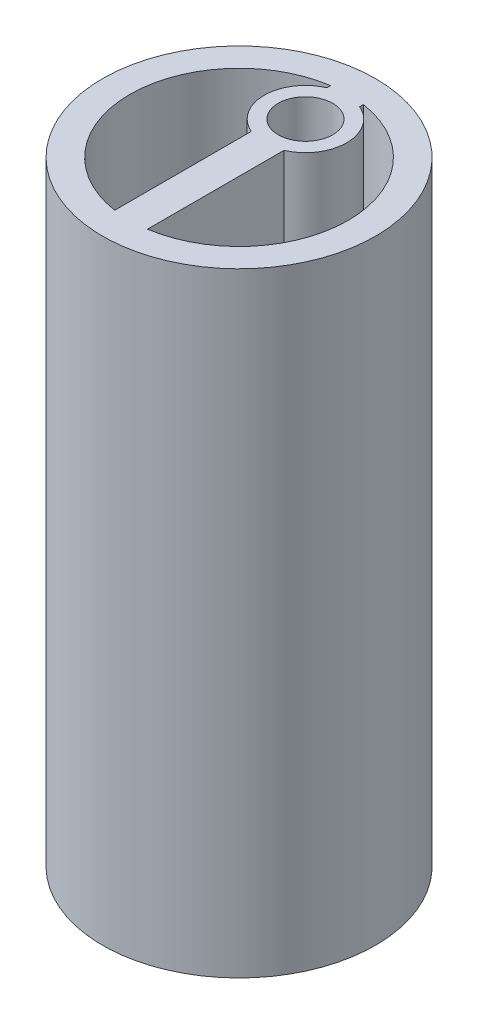
ISO-10303-21;
HEADER;
FILE_DESCRIPTION(('STEP AP214'),'2;1');
FILE_NAME('part.step','',(''),(''),'','','');
FILE_SCHEMA(('AUTOMOTIVE_DESIGN { 1 0 10303 214 1 1 1 1 }'));
ENDSEC;
DATA;
#1=APPLICATION_CONTEXT('core data for automotive mechanical design processes');
#2=APPLICATION_PROTOCOL_DEFINITION('international standard','automotive_design',2000,#1);
#3=PRODUCT_CONTEXT('',#1,'mechanical');
#4=PRODUCT('Part','Part','',(#3));
#5=PRODUCT_RELATED_PRODUCT_CATEGORY('part','',(#4));
#6=PRODUCT_DEFINITION_FORMATION('','',#4);
#7=PRODUCT_DEFINITION_CONTEXT('part definition',#1,'design');
#8=PRODUCT_DEFINITION('design','',#6,#7);
#9=PRODUCT_DEFINITION_SHAPE('','',#8);
#10=(LENGTH_UNIT() NAMED_UNIT(*) SI_UNIT(.MILLI.,.METRE.));
#11=(NAMED_UNIT(*) PLANE_ANGLE_UNIT() SI_UNIT($,.RADIAN.));
#12=(NAMED_UNIT(*) SI_UNIT($,.STERADIAN.) SOLID_ANGLE_UNIT());
#13=UNCERTAINTY_MEASURE_WITH_UNIT(LENGTH_MEASURE(1.E-05),#10,'distance_accuracy_value','');
#14=(GEOMETRIC_REPRESENTATION_CONTEXT(3) GLOBAL_UNCERTAINTY_ASSIGNED_CONTEXT((#13)) GLOBAL_UNIT_ASSIGNED_CONTEXT((#10,
#11,#12)) REPRESENTATION_CONTEXT('',''));
#15=CARTESIAN_POINT('',(0.,0.,0.));
#16=DIRECTION('',(0.,0.,1.));
#17=DIRECTION('',(1.,0.,0.));
#18=AXIS2_PLACEMENT_3D('',#15,#16,#17);
#19=CARTESIAN_POINT('',(-1.2,0.,-8.99315534845702));
#20=DIRECTION('',(-1.,0.,0.));
#21=DIRECTION('',(0.,0.,1.));
#22=AXIS2_PLACEMENT_3D('',#19,#20,#21);
#23=PLANE('',#22);
#24=DIRECTION('',(0.,1.,0.));
#25=VECTOR('',#24,1.);
#26=CARTESIAN_POINT('',(-1.2,0.,-2.09321424438531));
#27=LINE('',#26,#25);
#28=CARTESIAN_POINT('',(-1.2,0.,-2.09321424438531));
#29=VERTEX_POINT('',#28);
#30=CARTESIAN_POINT('',(-1.2,45.,-2.09321424438531));
#31=VERTEX_POINT('',#30);
#32=EDGE_CURVE('E185',#29,#31,#27,.T.);
#33=ORIENTED_EDGE('',*,*,#32,.F.);
#34=DIRECTION('',(0.,0.,1.));
#35=VECTOR('',#34,1.);
#36=CARTESIAN_POINT('',(-1.2,0.,-8.99315534845702));
#37=LINE('',#36,#35);
#38=CARTESIAN_POINT('',(-1.2,0.,7.90948797331408));
#39=VERTEX_POINT('',#38);
#40=EDGE_CURVE('E126',#29,#39,#37,.T.);
#41=ORIENTED_EDGE('',*,*,#40,.T.);
#42=DIRECTION('',(0.,-1.,0.));
#43=VECTOR('',#42,1.);
#44=CARTESIAN_POINT('',(-1.2,45.,7.90948797331407));
#45=LINE('',#44,#43);
#46=CARTESIAN_POINT('',(-1.2,45.,7.90948797331408));
#47=VERTEX_POINT('',#46);
#48=EDGE_CURVE('E160',#39,#47,#45,.F.);
#49=ORIENTED_EDGE('',*,*,#48,.T.);
#50=DIRECTION('',(0.,0.,1.));
#51=VECTOR('',#50,1.);
#52=CARTESIAN_POINT('',(-1.2,45.,-8.99315534845702));
#53=LINE('',#52,#51);
#54=EDGE_CURVE('E195',#31,#47,#53,.T.);
#55=ORIENTED_EDGE('',*,*,#54,.F.);
#56=EDGE_LOOP('',(#33,#41,#49,#55));
#57=FACE_BOUND('',#56,.T.);
#58=ADVANCED_FACE('F39',(#57),#23,.T.);
#59=CARTESIAN_POINT('',(1.2,0.,-8.99315534845702));
#60=DIRECTION('',(1.,0.,0.));
#61=DIRECTION('',(0.,0.,-1.));
#62=AXIS2_PLACEMENT_3D('',#59,#60,#61);
#63=PLANE('',#62);
#64=DIRECTION('',(0.,1.,0.));
#65=VECTOR('',#64,1.);
#66=CARTESIAN_POINT('',(1.2,0.,-7.63509099624298));
#67=LINE('',#66,#65);
#68=CARTESIAN_POINT('',(1.2,0.,-7.63509099624298));
#69=VERTEX_POINT('',#68);
#70=CARTESIAN_POINT('',(1.2,45.,-7.63509099624298));
#71=VERTEX_POINT('',#70);
#72=EDGE_CURVE('E11',#69,#71,#67,.T.);
#73=ORIENTED_EDGE('',*,*,#72,.F.);
#74=DIRECTION('',(0.,0.,-1.));
#75=VECTOR('',#74,1.);
#76=CARTESIAN_POINT('',(1.2,0.,-8.99315534845702));
#77=LINE('',#76,#75);
#78=CARTESIAN_POINT('',(1.2,0.,-7.90948797331408));
#79=VERTEX_POINT('',#78);
#80=EDGE_CURVE('E182',#69,#79,#77,.T.);
#81=ORIENTED_EDGE('',*,*,#80,.T.);
#82=DIRECTION('',(0.,-1.,0.));
#83=VECTOR('',#82,1.);
#84=CARTESIAN_POINT('',(1.2,45.,-7.90948797331407));
#85=LINE('',#84,#83);
#86=CARTESIAN_POINT('',(1.2,45.,-7.90948797331408));
#87=VERTEX_POINT('',#86);
#88=EDGE_CURVE('E150',#79,#87,#85,.F.);
#89=ORIENTED_EDGE('',*,*,#88,.T.);
#90=DIRECTION('',(0.,0.,-1.));
#91=VECTOR('',#90,1.);
#92=CARTESIAN_POINT('',(1.2,45.,-8.99315534845702));
#93=LINE('',#92,#91);
#94=EDGE_CURVE('E127',#71,#87,#93,.T.);
#95=ORIENTED_EDGE('',*,*,#94,.F.);
#96=EDGE_LOOP('',(#73,#81,#89,#95));
#97=FACE_BOUND('',#96,.T.);
#98=ADVANCED_FACE('F228',(#97),#63,.T.);
#99=CARTESIAN_POINT('',(0.,45.,0.));
#100=DIRECTION('',(0.,-1.,0.));
#101=DIRECTION('',(0.,0.,-1.));
#102=AXIS2_PLACEMENT_3D('',#99,#100,#101);
#103=CYLINDRICAL_SURFACE('',#102,8.);
#104=DIRECTION('',(0.,-1.,0.));
#105=VECTOR('',#104,1.);
#106=CARTESIAN_POINT('',(-1.2,45.,-7.90948797331407));
#107=LINE('',#106,#105);
#108=CARTESIAN_POINT('',(-1.2,45.,-7.90948797331408));
#109=VERTEX_POINT('',#108);
#110=CARTESIAN_POINT('',(-1.2,0.,-7.90948797331408));
#111=VERTEX_POINT('',#110);
#112=EDGE_CURVE('E119',#109,#111,#107,.T.);
#113=ORIENTED_EDGE('',*,*,#112,.F.);
#114=CARTESIAN_POINT('',(0.,45.,0.));
#115=DIRECTION('',(0.,1.,0.));
#116=DIRECTION('',(0.,0.,1.));
#117=AXIS2_PLACEMENT_3D('',#114,#115,#116);
#118=CIRCLE('',#117,8.);
#119=EDGE_CURVE('E140',#109,#47,#118,.T.);
#120=ORIENTED_EDGE('',*,*,#119,.T.);
#121=ORIENTED_EDGE('',*,*,#48,.F.);
#122=CARTESIAN_POINT('',(0.,0.,0.));
#123=DIRECTION('',(0.,1.,0.));
#124=DIRECTION('',(0.,0.,1.));
#125=AXIS2_PLACEMENT_3D('',#122,#123,#124);
#126=CIRCLE('',#125,8.);
#127=EDGE_CURVE('E145',#111,#39,#126,.T.);
#128=ORIENTED_EDGE('',*,*,#127,.F.);
#129=EDGE_LOOP('',(#113,#120,#121,#128));
#130=FACE_BOUND('',#129,.T.);
#131=ADVANCED_FACE('F191',(#130),#103,.F.);
#132=CARTESIAN_POINT('',(0.,45.,0.));
#133=DIRECTION('',(0.,1.,0.));
#134=DIRECTION('',(0.,0.,1.));
#135=AXIS2_PLACEMENT_3D('',#132,#133,#134);
#136=PLANE('',#135);
#137=CARTESIAN_POINT('',(0.,45.,-4.86415262031414));
#138=DIRECTION('',(0.,1.,0.));
#139=DIRECTION('',(0.,0.,1.));
#140=AXIS2_PLACEMENT_3D('',#137,#138,#139);
#141=CIRCLE('',#140,2.);
#142=CARTESIAN_POINT('',(0.,45.,-2.86415262031414));
#143=VERTEX_POINT('',#142);
#144=EDGE_CURVE('E205',#143,#143,#141,.T.);
#145=ORIENTED_EDGE('',*,*,#144,.F.);
#146=EDGE_LOOP('',(#145));
#147=FACE_BOUND('',#146,.T.);
#148=CARTESIAN_POINT('',(-1.2,45.,-7.63509099624298));
#149=VERTEX_POINT('',#148);
#150=EDGE_CURVE('E133',#109,#149,#53,.T.);
#151=ORIENTED_EDGE('',*,*,#150,.T.);
#152=CARTESIAN_POINT('',(0.,45.,-4.86415262031414));
#153=DIRECTION('',(0.,1.,0.));
#154=DIRECTION('',(0.,0.,1.));
#155=AXIS2_PLACEMENT_3D('',#152,#153,#154);
#156=CIRCLE('',#155,3.01961909571309);
#157=EDGE_CURVE('E55',#149,#31,#156,.T.);
#158=ORIENTED_EDGE('',*,*,#157,.T.);
#159=ORIENTED_EDGE('',*,*,#54,.T.);
#160=ORIENTED_EDGE('',*,*,#119,.F.);
#161=EDGE_LOOP('',(#151,#158,#159,#160));
#162=FACE_BOUND('',#161,.T.);
#163=CARTESIAN_POINT('',(1.2,45.,-2.09321424438531));
#164=VERTEX_POINT('',#163);
#165=EDGE_CURVE('E63',#164,#71,#156,.T.);
#166=ORIENTED_EDGE('',*,*,#165,.T.);
#167=ORIENTED_EDGE('',*,*,#94,.T.);
#168=CARTESIAN_POINT('',(1.2,45.,7.90948797331408));
#169=VERTEX_POINT('',#168);
#170=EDGE_CURVE('E123',#169,#87,#118,.T.);
#171=ORIENTED_EDGE('',*,*,#170,.F.);
#172=EDGE_CURVE('E115',#169,#164,#93,.T.);
#173=ORIENTED_EDGE('',*,*,#172,.T.);
#174=EDGE_LOOP('',(#166,#167,#171,#173));
#175=FACE_BOUND('',#174,.T.);
#176=CARTESIAN_POINT('',(0.,45.,0.));
#177=DIRECTION('',(0.,1.,0.));
#178=DIRECTION('',(0.,0.,1.));
#179=AXIS2_PLACEMENT_3D('',#176,#177,#178);
#180=CIRCLE('',#179,10.);
#181=CARTESIAN_POINT('',(0.,45.,-10.));
#182=VERTEX_POINT('',#181);
#183=EDGE_CURVE('E146',#182,#182,#180,.T.);
#184=ORIENTED_EDGE('',*,*,#183,.T.);
#185=EDGE_LOOP('',(#184));
#186=FACE_BOUND('',#185,.T.);
#187=ADVANCED_FACE('F120',(#147,#162,#175,#186),#136,.T.);
#188=CARTESIAN_POINT('',(0.,0.,0.));
#189=DIRECTION('',(0.,1.,0.));
#190=DIRECTION('',(0.,0.,1.));
#191=AXIS2_PLACEMENT_3D('',#188,#189,#190);
#192=PLANE('',#191);
#193=CARTESIAN_POINT('',(0.,0.,-4.86415262031414));
#194=DIRECTION('',(0.,1.,0.));
#195=DIRECTION('',(0.,0.,1.));
#196=AXIS2_PLACEMENT_3D('',#193,#194,#195);
#197=CIRCLE('',#196,2.);
#198=CARTESIAN_POINT('',(0.,0.,-2.86415262031414));
#199=VERTEX_POINT('',#198);
#200=EDGE_CURVE('E209',#199,#199,#197,.T.);
#201=ORIENTED_EDGE('',*,*,#200,.T.);
#202=EDGE_LOOP('',(#201));
#203=FACE_BOUND('',#202,.T.);
#204=CARTESIAN_POINT('',(0.,0.,-4.86415262031414));
#205=DIRECTION('',(0.,1.,0.));
#206=DIRECTION('',(0.,0.,1.));
#207=AXIS2_PLACEMENT_3D('',#204,#205,#206);
#208=CIRCLE('',#207,3.01961909571309);
#209=CARTESIAN_POINT('',(-1.2,0.,-7.63509099624298));
#210=VERTEX_POINT('',#209);
#211=EDGE_CURVE('E108',#210,#29,#208,.T.);
#212=ORIENTED_EDGE('',*,*,#211,.F.);
#213=EDGE_CURVE('E131',#111,#210,#37,.T.);
#214=ORIENTED_EDGE('',*,*,#213,.F.);
#215=ORIENTED_EDGE('',*,*,#127,.T.);
#216=ORIENTED_EDGE('',*,*,#40,.F.);
#217=EDGE_LOOP('',(#212,#214,#215,#216));
#218=FACE_BOUND('',#217,.T.);
#219=ORIENTED_EDGE('',*,*,#80,.F.);
#220=CARTESIAN_POINT('',(1.2,0.,-2.09321424438531));
#221=VERTEX_POINT('',#220);
#222=EDGE_CURVE('E201',#221,#69,#208,.T.);
#223=ORIENTED_EDGE('',*,*,#222,.F.);
#224=CARTESIAN_POINT('',(1.2,0.,7.90948797331408));
#225=VERTEX_POINT('',#224);
#226=EDGE_CURVE('E117',#225,#221,#77,.T.);
#227=ORIENTED_EDGE('',*,*,#226,.F.);
#228=EDGE_CURVE('E141',#225,#79,#126,.T.);
#229=ORIENTED_EDGE('',*,*,#228,.T.);
#230=EDGE_LOOP('',(#219,#223,#227,#229));
#231=FACE_BOUND('',#230,.T.);
#232=CARTESIAN_POINT('',(0.,0.,0.));
#233=DIRECTION('',(0.,1.,0.));
#234=DIRECTION('',(0.,0.,1.));
#235=AXIS2_PLACEMENT_3D('',#232,#233,#234);
#236=CIRCLE('',#235,10.);
#237=CARTESIAN_POINT('',(0.,0.,-10.));
#238=VERTEX_POINT('',#237);
#239=EDGE_CURVE('E139',#238,#238,#236,.T.);
#240=ORIENTED_EDGE('',*,*,#239,.F.);
#241=EDGE_LOOP('',(#240));
#242=FACE_BOUND('',#241,.T.);
#243=ADVANCED_FACE('F178',(#203,#218,#231,#242),#192,.F.);
#244=CARTESIAN_POINT('',(0.,45.,0.));
#245=DIRECTION('',(0.,-1.,0.));
#246=DIRECTION('',(0.,0.,-1.));
#247=AXIS2_PLACEMENT_3D('',#244,#245,#246);
#248=CYLINDRICAL_SURFACE('',#247,10.);
#249=CARTESIAN_POINT('',(0.,45.,-10.));
#250=CARTESIAN_POINT('',(0.,44.53125,-10.));
#251=CARTESIAN_POINT('',(0.,44.0625,-10.));
#252=CARTESIAN_POINT('',(0.,43.125,-10.));
#253=CARTESIAN_POINT('',(0.,42.65625,-10.));
#254=CARTESIAN_POINT('',(0.,41.71875,-10.));
#255=CARTESIAN_POINT('',(0.,41.25,-10.));
#256=CARTESIAN_POINT('',(0.,40.3125,-10.));
#257=CARTESIAN_POINT('',(0.,39.84375,-10.));
#258=CARTESIAN_POINT('',(0.,38.90625,-10.));
#259=CARTESIAN_POINT('',(0.,38.4375,-10.));
#260=CARTESIAN_POINT('',(0.,37.5,-10.));
#261=CARTESIAN_POINT('',(0.,37.03125,-10.));
#262=CARTESIAN_POINT('',(0.,36.09375,-10.));
#263=CARTESIAN_POINT('',(0.,35.625,-10.));
#264=CARTESIAN_POINT('',(0.,34.6875,-10.));
#265=CARTESIAN_POINT('',(0.,34.21875,-10.));
#266=CARTESIAN_POINT('',(0.,33.28125,-10.));
#267=CARTESIAN_POINT('',(0.,32.8125,-10.));
#268=CARTESIAN_POINT('',(0.,31.875,-10.));
#269=CARTESIAN_POINT('',(0.,31.40625,-10.));
#270=CARTESIAN_POINT('',(0.,30.46875,-10.));
#271=CARTESIAN_POINT('',(0.,30.,-10.));
#272=CARTESIAN_POINT('',(0.,29.0625,-10.));
#273=CARTESIAN_POINT('',(0.,28.59375,-10.));
#274=CARTESIAN_POINT('',(0.,27.65625,-10.));
#275=CARTESIAN_POINT('',(0.,27.1875,-10.));
#276=CARTESIAN_POINT('',(0.,26.25,-10.));
#277=CARTESIAN_POINT('',(0.,25.78125,-10.));
#278=CARTESIAN_POINT('',(0.,24.84375,-10.));
#279=CARTESIAN_POINT('',(0.,24.375,-10.));
#280=CARTESIAN_POINT('',(0.,23.4375,-10.));
#281=CARTESIAN_POINT('',(0.,22.96875,-10.));
#282=CARTESIAN_POINT('',(0.,22.03125,-10.));
#283=CARTESIAN_POINT('',(0.,21.5625,-10.));
#284=CARTESIAN_POINT('',(0.,20.625,-10.));
#285=CARTESIAN_POINT('',(0.,20.15625,-10.));
#286=CARTESIAN_POINT('',(0.,19.21875,-10.));
#287=CARTESIAN_POINT('',(0.,18.75,-10.));
#288=CARTESIAN_POINT('',(0.,17.8125,-10.));
#289=CARTESIAN_POINT('',(0.,17.34375,-10.));
#290=CARTESIAN_POINT('',(0.,16.40625,-10.));
#291=CARTESIAN_POINT('',(0.,15.9375,-10.));
#292=CARTESIAN_POINT('',(0.,15.,-10.));
#293=CARTESIAN_POINT('',(0.,14.53125,-10.));
#294=CARTESIAN_POINT('',(0.,13.59375,-10.));
#295=CARTESIAN_POINT('',(0.,13.125,-10.));
#296=CARTESIAN_POINT('',(0.,12.1875,-10.));
#297=CARTESIAN_POINT('',(0.,11.71875,-10.));
#298=CARTESIAN_POINT('',(0.,10.78125,-10.));
#299=CARTESIAN_POINT('',(0.,10.3125,-10.));
#300=CARTESIAN_POINT('',(0.,9.375,-10.));
#301=CARTESIAN_POINT('',(0.,8.90625,-10.));
#302=CARTESIAN_POINT('',(0.,7.96874999999999,-10.));
#303=CARTESIAN_POINT('',(0.,7.5,-10.));
#304=CARTESIAN_POINT('',(0.,6.5625,-10.));
#305=CARTESIAN_POINT('',(0.,6.09375,-10.));
#306=CARTESIAN_POINT('',(0.,5.15625,-10.));
#307=CARTESIAN_POINT('',(0.,4.68749999999999,-10.));
#308=CARTESIAN_POINT('',(0.,3.74999999999999,-10.));
#309=CARTESIAN_POINT('',(0.,3.28124999999999,-10.));
#310=CARTESIAN_POINT('',(0.,2.34374999999999,-10.));
#311=CARTESIAN_POINT('',(0.,1.87499999999999,-10.));
#312=CARTESIAN_POINT('',(0.,0.937499999999992,-10.));
#313=CARTESIAN_POINT('',(0.,0.468749999999993,-10.));
#314=CARTESIAN_POINT('',(0.,0.,-10.));
#315=B_SPLINE_CURVE_WITH_KNOTS('',3,(#249,#250,#251,#252,#253,#254,#255,#256,#257,#258,#259,
#260,#261,#262,#263,#264,#265,#266,#267,#268,#269,#270,#271,#272,#273,#274,#275,#276,#277,#278,
#279,#280,#281,#282,#283,#284,#285,#286,#287,#288,#289,#290,#291,#292,#293,#294,#295,#296,#297,
#298,#299,#300,#301,#302,#303,#304,#305,#306,#307,#308,#309,#310,#311,#312,#313,#314),
.UNSPECIFIED.,.F.,.F.,(4,2,2,2,2,2,2,2,2,2,2,2,2,2,2,2,2,2,2,2,2,2,2,2,2,2,2,2,2,2,2,2,4),(0.,
1.40625,2.8125,4.21875000000001,5.62500000000001,7.03125,8.4375,9.84375000000001,11.25,12.65625,
14.0625,15.46875,16.875,18.28125,19.6875,21.09375,22.5,23.90625,25.3125,26.71875,28.125,
29.53125,30.9375,32.34375,33.75,35.15625,36.5625,37.96875,39.375,40.78125,42.1875,43.59375,45.),.UNSPECIFIED.);
#316=EDGE_CURVE('BSEAM41',#182,#238,#315,.T.);
#317=ORIENTED_EDGE('',*,*,#183,.F.);
#318=ORIENTED_EDGE('',*,*,#239,.T.);
#319=ORIENTED_EDGE('',*,*,#316,.T.);
#320=ORIENTED_EDGE('',*,*,#316,.F.);
#321=EDGE_LOOP('',(#317,#319,#318,#320));
#322=FACE_BOUND('',#321,.T.);
#323=ADVANCED_FACE('F41',(#322),#248,.T.);
#324=DIRECTION('',(0.,-1.,0.));
#325=VECTOR('',#324,1.);
#326=CARTESIAN_POINT('',(1.2,45.,7.90948797331407));
#327=LINE('',#326,#325);
#328=EDGE_CURVE('E157',#169,#225,#327,.T.);
#329=ORIENTED_EDGE('',*,*,#328,.F.);
#330=ORIENTED_EDGE('',*,*,#170,.T.);
#331=ORIENTED_EDGE('',*,*,#88,.F.);
#332=ORIENTED_EDGE('',*,*,#228,.F.);
#333=EDGE_LOOP('',(#329,#330,#331,#332));
#334=FACE_BOUND('',#333,.T.);
#335=ADVANCED_FACE('F236',(#334),#103,.F.);
#336=DIRECTION('',(0.,1.,0.));
#337=VECTOR('',#336,1.);
#338=CARTESIAN_POINT('',(-1.2,0.,-7.63509099624298));
#339=LINE('',#338,#337);
#340=EDGE_CURVE('E198',#149,#210,#339,.F.);
#341=ORIENTED_EDGE('',*,*,#340,.F.);
#342=ORIENTED_EDGE('',*,*,#150,.F.);
#343=ORIENTED_EDGE('',*,*,#112,.T.);
#344=ORIENTED_EDGE('',*,*,#213,.T.);
#345=EDGE_LOOP('',(#341,#342,#343,#344));
#346=FACE_BOUND('',#345,.T.);
#347=ADVANCED_FACE('F172',(#346),#23,.T.);
#348=DIRECTION('',(0.,1.,0.));
#349=VECTOR('',#348,1.);
#350=CARTESIAN_POINT('',(1.2,0.,-2.09321424438531));
#351=LINE('',#350,#349);
#352=EDGE_CURVE('E48',#164,#221,#351,.F.);
#353=ORIENTED_EDGE('',*,*,#352,.F.);
#354=ORIENTED_EDGE('',*,*,#172,.F.);
#355=ORIENTED_EDGE('',*,*,#328,.T.);
#356=ORIENTED_EDGE('',*,*,#226,.T.);
#357=EDGE_LOOP('',(#353,#354,#355,#356));
#358=FACE_BOUND('',#357,.T.);
#359=ADVANCED_FACE('F113',(#358),#63,.T.);
#360=CARTESIAN_POINT('',(0.,0.,-4.86415262031414));
#361=DIRECTION('',(0.,1.,0.));
#362=DIRECTION('',(0.,0.,1.));
#363=AXIS2_PLACEMENT_3D('',#360,#361,#362);
#364=CYLINDRICAL_SURFACE('',#363,3.01961909571309);
#365=ORIENTED_EDGE('',*,*,#222,.T.);
#366=ORIENTED_EDGE('',*,*,#72,.T.);
#367=ORIENTED_EDGE('',*,*,#165,.F.);
#368=ORIENTED_EDGE('',*,*,#352,.T.);
#369=EDGE_LOOP('',(#365,#366,#367,#368));
#370=FACE_BOUND('',#369,.T.);
#371=ADVANCED_FACE('F103',(#370),#364,.T.);
#372=ORIENTED_EDGE('',*,*,#211,.T.);
#373=ORIENTED_EDGE('',*,*,#32,.T.);
#374=ORIENTED_EDGE('',*,*,#157,.F.);
#375=ORIENTED_EDGE('',*,*,#340,.T.);
#376=EDGE_LOOP('',(#372,#373,#374,#375));
#377=FACE_BOUND('',#376,.T.);
#378=ADVANCED_FACE('F216',(#377),#364,.T.);
#379=CARTESIAN_POINT('',(0.,0.,-4.86415262031414));
#380=DIRECTION('',(0.,1.,0.));
#381=DIRECTION('',(0.,0.,1.));
#382=AXIS2_PLACEMENT_3D('',#379,#380,#381);
#383=CYLINDRICAL_SURFACE('',#382,2.);
#384=CARTESIAN_POINT('',(0.,0.,-2.86415262031414));
#385=CARTESIAN_POINT('',(0.,0.468749999999999,-2.86415262031414));
#386=CARTESIAN_POINT('',(0.,0.9375,-2.86415262031414));
#387=CARTESIAN_POINT('',(0.,1.875,-2.86415262031414));
#388=CARTESIAN_POINT('',(0.,2.34375,-2.86415262031414));
#389=CARTESIAN_POINT('',(0.,3.28125,-2.86415262031414));
#390=CARTESIAN_POINT('',(0.,3.75,-2.86415262031414));
#391=CARTESIAN_POINT('',(0.,4.6875,-2.86415262031414));
#392=CARTESIAN_POINT('',(0.,5.15625,-2.86415262031414));
#393=CARTESIAN_POINT('',(0.,6.09375,-2.86415262031414));
#394=CARTESIAN_POINT('',(0.,6.5625,-2.86415262031414));
#395=CARTESIAN_POINT('',(0.,7.5,-2.86415262031414));
#396=CARTESIAN_POINT('',(0.,7.96875,-2.86415262031414));
#397=CARTESIAN_POINT('',(0.,8.90625,-2.86415262031414));
#398=CARTESIAN_POINT('',(0.,9.375,-2.86415262031414));
#399=CARTESIAN_POINT('',(0.,10.3125,-2.86415262031414));
#400=CARTESIAN_POINT('',(0.,10.78125,-2.86415262031414));
#401=CARTESIAN_POINT('',(0.,11.71875,-2.86415262031414));
#402=CARTESIAN_POINT('',(0.,12.1875,-2.86415262031414));
#403=CARTESIAN_POINT('',(0.,13.125,-2.86415262031414));
#404=CARTESIAN_POINT('',(0.,13.59375,-2.86415262031414));
#405=CARTESIAN_POINT('',(0.,14.53125,-2.86415262031414));
#406=CARTESIAN_POINT('',(0.,15.,-2.86415262031414));
#407=CARTESIAN_POINT('',(0.,15.9375,-2.86415262031414));
#408=CARTESIAN_POINT('',(0.,16.40625,-2.86415262031414));
#409=CARTESIAN_POINT('',(0.,17.34375,-2.86415262031414));
#410=CARTESIAN_POINT('',(0.,17.8125,-2.86415262031414));
#411=CARTESIAN_POINT('',(0.,18.75,-2.86415262031414));
#412=CARTESIAN_POINT('',(0.,19.21875,-2.86415262031414));
#413=CARTESIAN_POINT('',(0.,20.15625,-2.86415262031414));
#414=CARTESIAN_POINT('',(0.,20.625,-2.86415262031414));
#415=CARTESIAN_POINT('',(0.,21.5625,-2.86415262031414));
#416=CARTESIAN_POINT('',(0.,22.03125,-2.86415262031414));
#417=CARTESIAN_POINT('',(0.,22.96875,-2.86415262031414));
#418=CARTESIAN_POINT('',(0.,23.4375,-2.86415262031414));
#419=CARTESIAN_POINT('',(0.,24.375,-2.86415262031414));
#420=CARTESIAN_POINT('',(0.,24.84375,-2.86415262031414));
#421=CARTESIAN_POINT('',(0.,25.78125,-2.86415262031414));
#422=CARTESIAN_POINT('',(0.,26.25,-2.86415262031414));
#423=CARTESIAN_POINT('',(0.,27.1875,-2.86415262031414));
#424=CARTESIAN_POINT('',(0.,27.65625,-2.86415262031414));
#425=CARTESIAN_POINT('',(0.,28.59375,-2.86415262031414));
#426=CARTESIAN_POINT('',(0.,29.0625,-2.86415262031414));
#427=CARTESIAN_POINT('',(0.,30.,-2.86415262031414));
#428=CARTESIAN_POINT('',(0.,30.46875,-2.86415262031414));
#429=CARTESIAN_POINT('',(0.,31.40625,-2.86415262031414));
#430=CARTESIAN_POINT('',(0.,31.875,-2.86415262031414));
#431=CARTESIAN_POINT('',(0.,32.8125,-2.86415262031414));
#432=CARTESIAN_POINT('',(0.,33.28125,-2.86415262031414));
#433=CARTESIAN_POINT('',(0.,34.21875,-2.86415262031414));
#434=CARTESIAN_POINT('',(0.,34.6875,-2.86415262031414));
#435=CARTESIAN_POINT('',(0.,35.625,-2.86415262031414));
#436=CARTESIAN_POINT('',(0.,36.09375,-2.86415262031414));
#437=CARTESIAN_POINT('',(0.,37.03125,-2.86415262031414));
#438=CARTESIAN_POINT('',(0.,37.5,-2.86415262031414));
#439=CARTESIAN_POINT('',(0.,38.4375,-2.86415262031414));
#440=CARTESIAN_POINT('',(0.,38.90625,-2.86415262031414));
#441=CARTESIAN_POINT('',(0.,39.84375,-2.86415262031414));
#442=CARTESIAN_POINT('',(0.,40.3125,-2.86415262031414));
#443=CARTESIAN_POINT('',(0.,41.25,-2.86415262031414));
#444=CARTESIAN_POINT('',(0.,41.71875,-2.86415262031414));
#445=CARTESIAN_POINT('',(0.,42.65625,-2.86415262031414));
#446=CARTESIAN_POINT('',(0.,43.125,-2.86415262031414));
#447=CARTESIAN_POINT('',(0.,44.0625,-2.86415262031414));
#448=CARTESIAN_POINT('',(0.,44.53125,-2.86415262031414));
#449=CARTESIAN_POINT('',(0.,45.,-2.86415262031414));
#450=B_SPLINE_CURVE_WITH_KNOTS('',3,(#384,#385,#386,#387,#388,#389,#390,#391,#392,#393,#394,
#395,#396,#397,#398,#399,#400,#401,#402,#403,#404,#405,#406,#407,#408,#409,#410,#411,#412,#413,
#414,#415,#416,#417,#418,#419,#420,#421,#422,#423,#424,#425,#426,#427,#428,#429,#430,#431,#432,
#433,#434,#435,#436,#437,#438,#439,#440,#441,#442,#443,#444,#445,#446,#447,#448,#449),
.UNSPECIFIED.,.F.,.F.,(4,2,2,2,2,2,2,2,2,2,2,2,2,2,2,2,2,2,2,2,2,2,2,2,2,2,2,2,2,2,2,2,4),(0.,
1.40625,2.8125,4.21875,5.625,7.03125,8.4375,9.84375,11.25,12.65625,14.0625,15.46875,16.875,
18.28125,19.6875,21.09375,22.5,23.90625,25.3125,26.71875,28.125,29.53125,30.9375,32.34375,33.75,
35.15625,36.5625,37.96875,39.375,40.78125,42.1875,43.59375,45.),.UNSPECIFIED.);
#451=EDGE_CURVE('BSEAM218',#199,#143,#450,.T.);
#452=ORIENTED_EDGE('',*,*,#200,.F.);
#453=ORIENTED_EDGE('',*,*,#144,.T.);
#454=ORIENTED_EDGE('',*,*,#451,.T.);
#455=ORIENTED_EDGE('',*,*,#451,.F.);
#456=EDGE_LOOP('',(#452,#454,#453,#455));
#457=FACE_BOUND('',#456,.T.);
#458=ADVANCED_FACE('F218',(#457),#383,.F.);
#459=CLOSED_SHELL('',(#58,#98,#131,#187,#243,#323,#335,#347,#359,#371,#378,#458));
#460=MANIFOLD_SOLID_BREP('B2',#459);
#461=ADVANCED_BREP_SHAPE_REPRESENTATION('',(#18,#460),#14);
#462=SHAPE_DEFINITION_REPRESENTATION(#9,#461);
ENDSEC;
END-ISO-10303-21;
